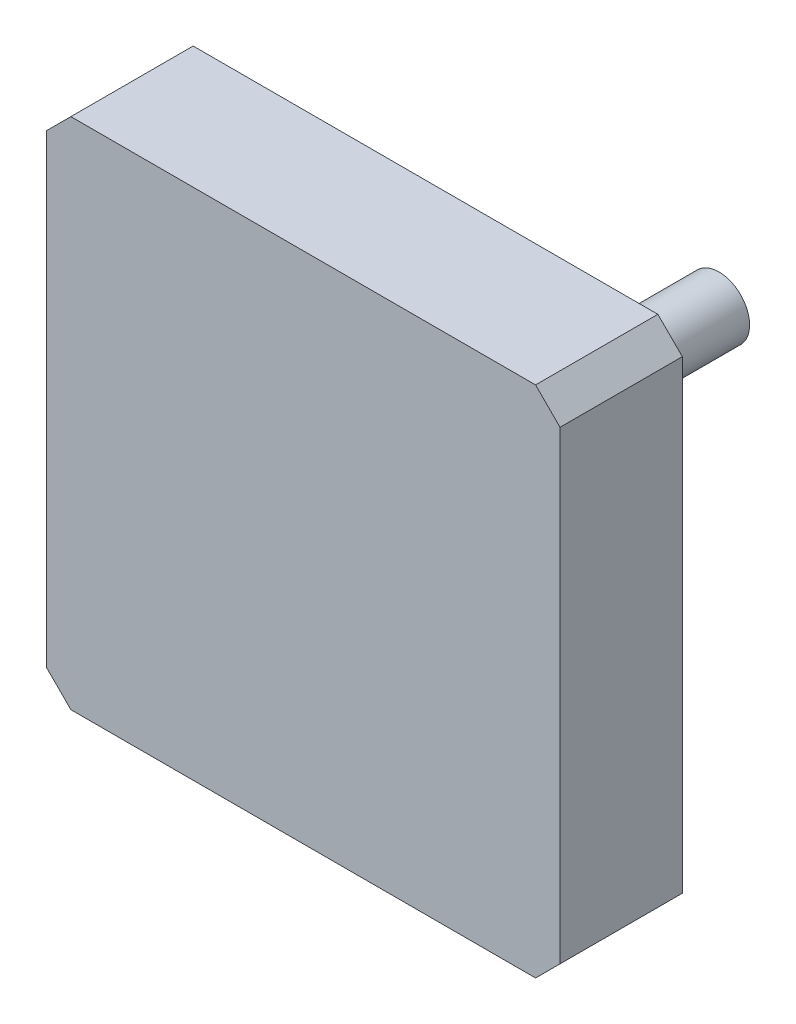
ISO-10303-21;
HEADER;
FILE_DESCRIPTION(('STEP AP214'),'2;1');
FILE_NAME('part.step','',(''),(''),'','','');
FILE_SCHEMA(('AUTOMOTIVE_DESIGN { 1 0 10303 214 1 1 1 1 }'));
ENDSEC;
DATA;
#1=APPLICATION_CONTEXT('core data for automotive mechanical design processes');
#2=APPLICATION_PROTOCOL_DEFINITION('international standard','automotive_design',2000,#1);
#3=PRODUCT_CONTEXT('',#1,'mechanical');
#4=PRODUCT('Part','Part','',(#3));
#5=PRODUCT_RELATED_PRODUCT_CATEGORY('part','',(#4));
#6=PRODUCT_DEFINITION_FORMATION('','',#4);
#7=PRODUCT_DEFINITION_CONTEXT('part definition',#1,'design');
#8=PRODUCT_DEFINITION('design','',#6,#7);
#9=PRODUCT_DEFINITION_SHAPE('','',#8);
#10=(LENGTH_UNIT() NAMED_UNIT(*) SI_UNIT(.MILLI.,.METRE.));
#11=(NAMED_UNIT(*) PLANE_ANGLE_UNIT() SI_UNIT($,.RADIAN.));
#12=(NAMED_UNIT(*) SI_UNIT($,.STERADIAN.) SOLID_ANGLE_UNIT());
#13=UNCERTAINTY_MEASURE_WITH_UNIT(LENGTH_MEASURE(1.E-05),#10,'distance_accuracy_value','');
#14=(GEOMETRIC_REPRESENTATION_CONTEXT(3) GLOBAL_UNCERTAINTY_ASSIGNED_CONTEXT((#13)) GLOBAL_UNIT_ASSIGNED_CONTEXT((#10,
#11,#12)) REPRESENTATION_CONTEXT('',''));
#15=CARTESIAN_POINT('',(0.,0.,0.));
#16=DIRECTION('',(0.,0.,1.));
#17=DIRECTION('',(1.,0.,0.));
#18=AXIS2_PLACEMENT_3D('',#15,#16,#17);
#19=CARTESIAN_POINT('',(0.,0.,-10.));
#20=DIRECTION('',(0.,0.,1.));
#21=DIRECTION('',(-1.,0.,0.));
#22=AXIS2_PLACEMENT_3D('',#19,#20,#21);
#23=PLANE('',#22);
#24=CARTESIAN_POINT('',(-15.4999999999998,15.5000000000002,-10.));
#25=DIRECTION('',(0.,0.,1.));
#26=DIRECTION('',(1.,0.,0.));
#27=AXIS2_PLACEMENT_3D('',#24,#25,#26);
#28=CIRCLE('',#27,1.25);
#29=CARTESIAN_POINT('',(-14.2499999999998,15.5000000000002,-10.));
#30=VERTEX_POINT('',#29);
#31=EDGE_CURVE('E122',#30,#30,#28,.T.);
#32=ORIENTED_EDGE('',*,*,#31,.T.);
#33=EDGE_LOOP('',(#32));
#34=FACE_BOUND('',#33,.T.);
#35=CARTESIAN_POINT('',(-15.5,-15.5,-10.));
#36=DIRECTION('',(0.,0.,1.));
#37=DIRECTION('',(1.,0.,0.));
#38=AXIS2_PLACEMENT_3D('',#35,#36,#37);
#39=CIRCLE('',#38,1.25);
#40=CARTESIAN_POINT('',(-14.25,-15.5,-10.));
#41=VERTEX_POINT('',#40);
#42=EDGE_CURVE('E121',#41,#41,#39,.T.);
#43=ORIENTED_EDGE('',*,*,#42,.T.);
#44=EDGE_LOOP('',(#43));
#45=FACE_BOUND('',#44,.T.);
#46=CARTESIAN_POINT('',(15.4999999999999,-15.5000000000001,-10.));
#47=DIRECTION('',(0.,0.,1.));
#48=DIRECTION('',(1.,0.,0.));
#49=AXIS2_PLACEMENT_3D('',#46,#47,#48);
#50=CIRCLE('',#49,1.25);
#51=CARTESIAN_POINT('',(16.7499999999999,-15.5000000000001,-10.));
#52=VERTEX_POINT('',#51);
#53=EDGE_CURVE('E132',#52,#52,#50,.T.);
#54=ORIENTED_EDGE('',*,*,#53,.T.);
#55=EDGE_LOOP('',(#54));
#56=FACE_BOUND('',#55,.T.);
#57=CARTESIAN_POINT('',(15.5,15.5,-10.));
#58=DIRECTION('',(0.,0.,1.));
#59=DIRECTION('',(1.,0.,0.));
#60=AXIS2_PLACEMENT_3D('',#57,#58,#59);
#61=CIRCLE('',#60,1.25);
#62=CARTESIAN_POINT('',(16.75,15.5,-10.));
#63=VERTEX_POINT('',#62);
#64=EDGE_CURVE('E138',#63,#63,#61,.T.);
#65=ORIENTED_EDGE('',*,*,#64,.T.);
#66=EDGE_LOOP('',(#65));
#67=FACE_BOUND('',#66,.T.);
#68=DIRECTION('',(0.,-1.,0.));
#69=VECTOR('',#68,1.);
#70=CARTESIAN_POINT('',(-21.,-21.,-10.));
#71=LINE('',#70,#69);
#72=CARTESIAN_POINT('',(-21.,19.,-10.));
#73=VERTEX_POINT('',#72);
#74=CARTESIAN_POINT('',(-21.,-19.,-10.));
#75=VERTEX_POINT('',#74);
#76=EDGE_CURVE('E158',#73,#75,#71,.T.);
#77=ORIENTED_EDGE('',*,*,#76,.F.);
#78=DIRECTION('',(0.70710678118655,0.707106781186545,0.));
#79=VECTOR('',#78,1.);
#80=CARTESIAN_POINT('',(-21.,19.,-10.));
#81=LINE('',#80,#79);
#82=CARTESIAN_POINT('',(-19.,21.,-10.));
#83=VERTEX_POINT('',#82);
#84=EDGE_CURVE('E199',#83,#73,#81,.F.);
#85=ORIENTED_EDGE('',*,*,#84,.F.);
#86=DIRECTION('',(-1.,0.,0.));
#87=VECTOR('',#86,1.);
#88=CARTESIAN_POINT('',(-21.,21.,-10.));
#89=LINE('',#88,#87);
#90=CARTESIAN_POINT('',(19.,21.,-10.));
#91=VERTEX_POINT('',#90);
#92=EDGE_CURVE('E155',#91,#83,#89,.T.);
#93=ORIENTED_EDGE('',*,*,#92,.F.);
#94=DIRECTION('',(0.707106781186545,-0.70710678118655,0.));
#95=VECTOR('',#94,1.);
#96=CARTESIAN_POINT('',(19.,21.,-10.));
#97=LINE('',#96,#95);
#98=CARTESIAN_POINT('',(21.,19.,-10.));
#99=VERTEX_POINT('',#98);
#100=EDGE_CURVE('E197',#99,#91,#97,.F.);
#101=ORIENTED_EDGE('',*,*,#100,.F.);
#102=DIRECTION('',(0.,1.,0.));
#103=VECTOR('',#102,1.);
#104=CARTESIAN_POINT('',(21.,-21.,-10.));
#105=LINE('',#104,#103);
#106=CARTESIAN_POINT('',(21.,-19.,-10.));
#107=VERTEX_POINT('',#106);
#108=EDGE_CURVE('E152',#107,#99,#105,.T.);
#109=ORIENTED_EDGE('',*,*,#108,.F.);
#110=DIRECTION('',(-0.70710678118655,-0.707106781186545,0.));
#111=VECTOR('',#110,1.);
#112=CARTESIAN_POINT('',(21.,-19.,-10.));
#113=LINE('',#112,#111);
#114=CARTESIAN_POINT('',(19.,-21.,-10.));
#115=VERTEX_POINT('',#114);
#116=EDGE_CURVE('E201',#115,#107,#113,.F.);
#117=ORIENTED_EDGE('',*,*,#116,.F.);
#118=DIRECTION('',(1.,0.,0.));
#119=VECTOR('',#118,1.);
#120=CARTESIAN_POINT('',(-21.,-21.,-10.));
#121=LINE('',#120,#119);
#122=CARTESIAN_POINT('',(-19.,-21.,-10.));
#123=VERTEX_POINT('',#122);
#124=EDGE_CURVE('E161',#123,#115,#121,.T.);
#125=ORIENTED_EDGE('',*,*,#124,.F.);
#126=DIRECTION('',(-0.707106781186545,0.70710678118655,0.));
#127=VECTOR('',#126,1.);
#128=CARTESIAN_POINT('',(-19.,-21.,-10.));
#129=LINE('',#128,#127);
#130=EDGE_CURVE('E204',#75,#123,#129,.F.);
#131=ORIENTED_EDGE('',*,*,#130,.F.);
#132=EDGE_LOOP('',(#77,#85,#93,#101,#109,#117,#125,#131));
#133=FACE_BOUND('',#132,.T.);
#134=CARTESIAN_POINT('',(0.,0.,-10.));
#135=DIRECTION('',(0.,0.,-1.));
#136=DIRECTION('',(-1.,0.,0.));
#137=AXIS2_PLACEMENT_3D('',#134,#135,#136);
#138=CIRCLE('',#137,11.);
#139=CARTESIAN_POINT('',(-11.,0.,-10.));
#140=VERTEX_POINT('',#139);
#141=EDGE_CURVE('E164',#140,#140,#138,.F.);
#142=ORIENTED_EDGE('',*,*,#141,.T.);
#143=EDGE_LOOP('',(#142));
#144=FACE_BOUND('',#143,.T.);
#145=ADVANCED_FACE('F37',(#34,#45,#56,#67,#133,#144),#23,.F.);
#146=CARTESIAN_POINT('',(21.,-21.,-10.));
#147=DIRECTION('',(-1.,0.,0.));
#148=DIRECTION('',(0.,0.,-1.));
#149=AXIS2_PLACEMENT_3D('',#146,#147,#148);
#150=PLANE('',#149);
#151=ORIENTED_EDGE('',*,*,#108,.T.);
#152=DIRECTION('',(0.,0.,-1.));
#153=VECTOR('',#152,1.);
#154=CARTESIAN_POINT('',(21.,19.,-10.));
#155=LINE('',#154,#153);
#156=CARTESIAN_POINT('',(21.,19.,0.));
#157=VERTEX_POINT('',#156);
#158=EDGE_CURVE('E207',#157,#99,#155,.T.);
#159=ORIENTED_EDGE('',*,*,#158,.F.);
#160=DIRECTION('',(0.,1.,0.));
#161=VECTOR('',#160,1.);
#162=CARTESIAN_POINT('',(21.,-21.,0.));
#163=LINE('',#162,#161);
#164=CARTESIAN_POINT('',(21.,-19.,0.));
#165=VERTEX_POINT('',#164);
#166=EDGE_CURVE('E151',#165,#157,#163,.T.);
#167=ORIENTED_EDGE('',*,*,#166,.F.);
#168=DIRECTION('',(0.,0.,1.));
#169=VECTOR('',#168,1.);
#170=CARTESIAN_POINT('',(21.,-19.,-10.));
#171=LINE('',#170,#169);
#172=EDGE_CURVE('E209',#107,#165,#171,.T.);
#173=ORIENTED_EDGE('',*,*,#172,.F.);
#174=EDGE_LOOP('',(#151,#159,#167,#173));
#175=FACE_BOUND('',#174,.T.);
#176=ADVANCED_FACE('F220',(#175),#150,.F.);
#177=CARTESIAN_POINT('',(-21.,21.,-10.));
#178=DIRECTION('',(0.,-1.,0.));
#179=DIRECTION('',(0.,0.,1.));
#180=AXIS2_PLACEMENT_3D('',#177,#178,#179);
#181=PLANE('',#180);
#182=DIRECTION('',(-1.,0.,0.));
#183=VECTOR('',#182,1.);
#184=CARTESIAN_POINT('',(-21.,21.,0.));
#185=LINE('',#184,#183);
#186=CARTESIAN_POINT('',(19.,21.,0.));
#187=VERTEX_POINT('',#186);
#188=CARTESIAN_POINT('',(-19.,21.,0.));
#189=VERTEX_POINT('',#188);
#190=EDGE_CURVE('E167',#187,#189,#185,.T.);
#191=ORIENTED_EDGE('',*,*,#190,.F.);
#192=DIRECTION('',(0.,0.,1.));
#193=VECTOR('',#192,1.);
#194=CARTESIAN_POINT('',(19.,21.,-10.));
#195=LINE('',#194,#193);
#196=EDGE_CURVE('E45',#91,#187,#195,.T.);
#197=ORIENTED_EDGE('',*,*,#196,.F.);
#198=ORIENTED_EDGE('',*,*,#92,.T.);
#199=DIRECTION('',(0.,0.,-1.));
#200=VECTOR('',#199,1.);
#201=CARTESIAN_POINT('',(-19.,21.,-10.));
#202=LINE('',#201,#200);
#203=EDGE_CURVE('E11',#189,#83,#202,.T.);
#204=ORIENTED_EDGE('',*,*,#203,.F.);
#205=EDGE_LOOP('',(#191,#197,#198,#204));
#206=FACE_BOUND('',#205,.T.);
#207=ADVANCED_FACE('F214',(#206),#181,.F.);
#208=CARTESIAN_POINT('',(-21.,-21.,-10.));
#209=DIRECTION('',(1.,0.,0.));
#210=DIRECTION('',(0.,0.,1.));
#211=AXIS2_PLACEMENT_3D('',#208,#209,#210);
#212=PLANE('',#211);
#213=DIRECTION('',(0.,-1.,0.));
#214=VECTOR('',#213,1.);
#215=CARTESIAN_POINT('',(-21.,-21.,0.));
#216=LINE('',#215,#214);
#217=CARTESIAN_POINT('',(-21.,19.,0.));
#218=VERTEX_POINT('',#217);
#219=CARTESIAN_POINT('',(-21.,-19.,0.));
#220=VERTEX_POINT('',#219);
#221=EDGE_CURVE('E170',#218,#220,#216,.T.);
#222=ORIENTED_EDGE('',*,*,#221,.F.);
#223=DIRECTION('',(0.,0.,1.));
#224=VECTOR('',#223,1.);
#225=CARTESIAN_POINT('',(-21.,19.,-10.));
#226=LINE('',#225,#224);
#227=EDGE_CURVE('E192',#73,#218,#226,.T.);
#228=ORIENTED_EDGE('',*,*,#227,.F.);
#229=ORIENTED_EDGE('',*,*,#76,.T.);
#230=DIRECTION('',(0.,0.,-1.));
#231=VECTOR('',#230,1.);
#232=CARTESIAN_POINT('',(-21.,-19.,-10.));
#233=LINE('',#232,#231);
#234=EDGE_CURVE('E195',#220,#75,#233,.T.);
#235=ORIENTED_EDGE('',*,*,#234,.F.);
#236=EDGE_LOOP('',(#222,#228,#229,#235));
#237=FACE_BOUND('',#236,.T.);
#238=ADVANCED_FACE('F232',(#237),#212,.F.);
#239=CARTESIAN_POINT('',(-21.,-21.,-10.));
#240=DIRECTION('',(0.,1.,0.));
#241=DIRECTION('',(0.,0.,-1.));
#242=AXIS2_PLACEMENT_3D('',#239,#240,#241);
#243=PLANE('',#242);
#244=ORIENTED_EDGE('',*,*,#124,.T.);
#245=DIRECTION('',(0.,0.,-1.));
#246=VECTOR('',#245,1.);
#247=CARTESIAN_POINT('',(19.,-21.,-10.));
#248=LINE('',#247,#246);
#249=CARTESIAN_POINT('',(19.,-21.,0.));
#250=VERTEX_POINT('',#249);
#251=EDGE_CURVE('E179',#250,#115,#248,.T.);
#252=ORIENTED_EDGE('',*,*,#251,.F.);
#253=DIRECTION('',(1.,0.,0.));
#254=VECTOR('',#253,1.);
#255=CARTESIAN_POINT('',(-21.,-21.,0.));
#256=LINE('',#255,#254);
#257=CARTESIAN_POINT('',(-19.,-21.,0.));
#258=VERTEX_POINT('',#257);
#259=EDGE_CURVE('E156',#258,#250,#256,.T.);
#260=ORIENTED_EDGE('',*,*,#259,.F.);
#261=DIRECTION('',(0.,0.,1.));
#262=VECTOR('',#261,1.);
#263=CARTESIAN_POINT('',(-19.,-21.,-10.));
#264=LINE('',#263,#262);
#265=EDGE_CURVE('E181',#123,#258,#264,.T.);
#266=ORIENTED_EDGE('',*,*,#265,.F.);
#267=EDGE_LOOP('',(#244,#252,#260,#266));
#268=FACE_BOUND('',#267,.T.);
#269=ADVANCED_FACE('F239',(#268),#243,.F.);
#270=CARTESIAN_POINT('',(0.,0.,0.));
#271=DIRECTION('',(0.,0.,1.));
#272=DIRECTION('',(-1.,0.,0.));
#273=AXIS2_PLACEMENT_3D('',#270,#271,#272);
#274=PLANE('',#273);
#275=ORIENTED_EDGE('',*,*,#259,.T.);
#276=DIRECTION('',(0.70710678118655,0.707106781186545,0.));
#277=VECTOR('',#276,1.);
#278=CARTESIAN_POINT('',(19.9999999999999,-20.0000000000001,0.));
#279=LINE('',#278,#277);
#280=EDGE_CURVE('E188',#165,#250,#279,.F.);
#281=ORIENTED_EDGE('',*,*,#280,.F.);
#282=ORIENTED_EDGE('',*,*,#166,.T.);
#283=DIRECTION('',(-0.707106781186545,0.70710678118655,0.));
#284=VECTOR('',#283,1.);
#285=CARTESIAN_POINT('',(20.0000000000001,19.9999999999999,0.));
#286=LINE('',#285,#284);
#287=EDGE_CURVE('E184',#187,#157,#286,.F.);
#288=ORIENTED_EDGE('',*,*,#287,.F.);
#289=ORIENTED_EDGE('',*,*,#190,.T.);
#290=DIRECTION('',(-0.70710678118655,-0.707106781186545,0.));
#291=VECTOR('',#290,1.);
#292=CARTESIAN_POINT('',(-19.9999999999999,20.0000000000001,0.));
#293=LINE('',#292,#291);
#294=EDGE_CURVE('E186',#218,#189,#293,.F.);
#295=ORIENTED_EDGE('',*,*,#294,.F.);
#296=ORIENTED_EDGE('',*,*,#221,.T.);
#297=DIRECTION('',(0.707106781186545,-0.70710678118655,0.));
#298=VECTOR('',#297,1.);
#299=CARTESIAN_POINT('',(-20.0000000000001,-19.9999999999999,0.));
#300=LINE('',#299,#298);
#301=EDGE_CURVE('E190',#258,#220,#300,.F.);
#302=ORIENTED_EDGE('',*,*,#301,.F.);
#303=EDGE_LOOP('',(#275,#281,#282,#288,#289,#295,#296,#302));
#304=FACE_BOUND('',#303,.T.);
#305=ADVANCED_FACE('F216',(#304),#274,.T.);
#306=CARTESIAN_POINT('',(0.,0.,-12.));
#307=DIRECTION('',(0.,0.,-1.));
#308=DIRECTION('',(1.,0.,0.));
#309=AXIS2_PLACEMENT_3D('',#306,#307,#308);
#310=PLANE('',#309);
#311=CARTESIAN_POINT('',(0.,0.,-12.));
#312=DIRECTION('',(0.,0.,1.));
#313=DIRECTION('',(1.,0.,0.));
#314=AXIS2_PLACEMENT_3D('',#311,#312,#313);
#315=CIRCLE('',#314,11.);
#316=CARTESIAN_POINT('',(11.,0.,-12.));
#317=VERTEX_POINT('',#316);
#318=EDGE_CURVE('E144',#317,#317,#315,.T.);
#319=ORIENTED_EDGE('',*,*,#318,.F.);
#320=EDGE_LOOP('',(#319));
#321=FACE_BOUND('',#320,.T.);
#322=CARTESIAN_POINT('',(0.,0.,-12.));
#323=DIRECTION('',(0.,0.,1.));
#324=DIRECTION('',(1.,0.,0.));
#325=AXIS2_PLACEMENT_3D('',#322,#323,#324);
#326=CIRCLE('',#325,2.5);
#327=CARTESIAN_POINT('',(2.5,0.,-12.));
#328=VERTEX_POINT('',#327);
#329=EDGE_CURVE('E147',#328,#328,#326,.T.);
#330=ORIENTED_EDGE('',*,*,#329,.T.);
#331=EDGE_LOOP('',(#330));
#332=FACE_BOUND('',#331,.T.);
#333=ADVANCED_FACE('F263',(#321,#332),#310,.T.);
#334=CARTESIAN_POINT('',(0.,0.,-12.));
#335=DIRECTION('',(0.,0.,1.));
#336=DIRECTION('',(-1.,0.,0.));
#337=AXIS2_PLACEMENT_3D('',#334,#335,#336);
#338=CYLINDRICAL_SURFACE('',#337,11.);
#339=ORIENTED_EDGE('',*,*,#318,.T.);
#340=EDGE_LOOP('',(#339));
#341=FACE_BOUND('',#340,.T.);
#342=ORIENTED_EDGE('',*,*,#141,.F.);
#343=EDGE_LOOP('',(#342));
#344=FACE_BOUND('',#343,.T.);
#345=ADVANCED_FACE('F291',(#341,#344),#338,.T.);
#346=CARTESIAN_POINT('',(0.,0.,-34.));
#347=DIRECTION('',(0.,0.,-1.));
#348=DIRECTION('',(1.,0.,0.));
#349=AXIS2_PLACEMENT_3D('',#346,#347,#348);
#350=PLANE('',#349);
#351=CARTESIAN_POINT('',(0.,0.,-34.));
#352=DIRECTION('',(0.,0.,1.));
#353=DIRECTION('',(1.,0.,0.));
#354=AXIS2_PLACEMENT_3D('',#351,#352,#353);
#355=CIRCLE('',#354,2.5);
#356=CARTESIAN_POINT('',(2.5,0.,-34.));
#357=VERTEX_POINT('',#356);
#358=EDGE_CURVE('E148',#357,#357,#355,.T.);
#359=ORIENTED_EDGE('',*,*,#358,.F.);
#360=EDGE_LOOP('',(#359));
#361=FACE_BOUND('',#360,.T.);
#362=ADVANCED_FACE('F299',(#361),#350,.T.);
#363=CARTESIAN_POINT('',(0.,0.,-34.));
#364=DIRECTION('',(0.,0.,1.));
#365=DIRECTION('',(-1.,0.,0.));
#366=AXIS2_PLACEMENT_3D('',#363,#364,#365);
#367=CYLINDRICAL_SURFACE('',#366,2.5);
#368=ORIENTED_EDGE('',*,*,#329,.F.);
#369=EDGE_LOOP('',(#368));
#370=FACE_BOUND('',#369,.T.);
#371=ORIENTED_EDGE('',*,*,#358,.T.);
#372=EDGE_LOOP('',(#371));
#373=FACE_BOUND('',#372,.T.);
#374=ADVANCED_FACE('F248',(#370,#373),#367,.T.);
#375=CARTESIAN_POINT('',(-19.,-21.,-10.));
#376=DIRECTION('',(0.70710678118655,0.707106781186545,0.));
#377=DIRECTION('',(0.,0.,1.));
#378=AXIS2_PLACEMENT_3D('',#375,#376,#377);
#379=PLANE('',#378);
#380=ORIENTED_EDGE('',*,*,#130,.T.);
#381=ORIENTED_EDGE('',*,*,#265,.T.);
#382=ORIENTED_EDGE('',*,*,#301,.T.);
#383=ORIENTED_EDGE('',*,*,#234,.T.);
#384=EDGE_LOOP('',(#380,#381,#382,#383));
#385=FACE_BOUND('',#384,.T.);
#386=ADVANCED_FACE('F236',(#385),#379,.F.);
#387=CARTESIAN_POINT('',(21.,-19.,-10.));
#388=DIRECTION('',(-0.707106781186545,0.70710678118655,0.));
#389=DIRECTION('',(0.,0.,1.));
#390=AXIS2_PLACEMENT_3D('',#387,#388,#389);
#391=PLANE('',#390);
#392=ORIENTED_EDGE('',*,*,#116,.T.);
#393=ORIENTED_EDGE('',*,*,#172,.T.);
#394=ORIENTED_EDGE('',*,*,#280,.T.);
#395=ORIENTED_EDGE('',*,*,#251,.T.);
#396=EDGE_LOOP('',(#392,#393,#394,#395));
#397=FACE_BOUND('',#396,.T.);
#398=ADVANCED_FACE('F241',(#397),#391,.F.);
#399=CARTESIAN_POINT('',(-21.,19.,-10.));
#400=DIRECTION('',(0.707106781186545,-0.70710678118655,0.));
#401=DIRECTION('',(0.,0.,1.));
#402=AXIS2_PLACEMENT_3D('',#399,#400,#401);
#403=PLANE('',#402);
#404=ORIENTED_EDGE('',*,*,#84,.T.);
#405=ORIENTED_EDGE('',*,*,#227,.T.);
#406=ORIENTED_EDGE('',*,*,#294,.T.);
#407=ORIENTED_EDGE('',*,*,#203,.T.);
#408=EDGE_LOOP('',(#404,#405,#406,#407));
#409=FACE_BOUND('',#408,.T.);
#410=ADVANCED_FACE('F228',(#409),#403,.F.);
#411=CARTESIAN_POINT('',(19.,21.,-10.));
#412=DIRECTION('',(-0.70710678118655,-0.707106781186545,0.));
#413=DIRECTION('',(0.,0.,1.));
#414=AXIS2_PLACEMENT_3D('',#411,#412,#413);
#415=PLANE('',#414);
#416=ORIENTED_EDGE('',*,*,#100,.T.);
#417=ORIENTED_EDGE('',*,*,#196,.T.);
#418=ORIENTED_EDGE('',*,*,#287,.T.);
#419=ORIENTED_EDGE('',*,*,#158,.T.);
#420=EDGE_LOOP('',(#416,#417,#418,#419));
#421=FACE_BOUND('',#420,.T.);
#422=ADVANCED_FACE('F39',(#421),#415,.F.);
#423=CARTESIAN_POINT('',(15.5,15.5,-2.5));
#424=DIRECTION('',(0.,0.,-1.));
#425=DIRECTION('',(1.,0.,0.));
#426=AXIS2_PLACEMENT_3D('',#423,#424,#425);
#427=CONICAL_SURFACE('',#426,1.25,1.02974425867665);
#428=CARTESIAN_POINT('',(15.5,15.5,-1.74892422621555));
#429=VERTEX_POINT('',#428);
#430=VERTEX_LOOP('',#429);
#431=FACE_BOUND('',#430,.T.);
#432=CARTESIAN_POINT('',(15.5,15.5,-2.5));
#433=DIRECTION('',(0.,0.,1.));
#434=DIRECTION('',(1.,0.,0.));
#435=AXIS2_PLACEMENT_3D('',#432,#433,#434);
#436=CIRCLE('',#435,1.25);
#437=CARTESIAN_POINT('',(16.75,15.5,-2.5));
#438=VERTEX_POINT('',#437);
#439=EDGE_CURVE('E141',#438,#438,#436,.T.);
#440=ORIENTED_EDGE('',*,*,#439,.F.);
#441=EDGE_LOOP('',(#440));
#442=FACE_BOUND('',#441,.T.);
#443=ADVANCED_FACE('F336',(#431,#442),#427,.F.);
#444=CARTESIAN_POINT('',(15.5,15.5,-10.));
#445=DIRECTION('',(0.,0.,-1.));
#446=DIRECTION('',(1.,0.,0.));
#447=AXIS2_PLACEMENT_3D('',#444,#445,#446);
#448=CYLINDRICAL_SURFACE('',#447,1.25);
#449=ORIENTED_EDGE('',*,*,#439,.T.);
#450=EDGE_LOOP('',(#449));
#451=FACE_BOUND('',#450,.T.);
#452=ORIENTED_EDGE('',*,*,#64,.F.);
#453=EDGE_LOOP('',(#452));
#454=FACE_BOUND('',#453,.T.);
#455=ADVANCED_FACE('F344',(#451,#454),#448,.F.);
#456=CARTESIAN_POINT('',(15.4999999999999,-15.5000000000001,-2.5));
#457=DIRECTION('',(0.,0.,-1.));
#458=DIRECTION('',(1.,0.,0.));
#459=AXIS2_PLACEMENT_3D('',#456,#457,#458);
#460=CONICAL_SURFACE('',#459,1.25,1.02974425867665);
#461=CARTESIAN_POINT('',(15.4999999999999,-15.5000000000001,-1.74892422621555));
#462=VERTEX_POINT('',#461);
#463=VERTEX_LOOP('',#462);
#464=FACE_BOUND('',#463,.T.);
#465=CARTESIAN_POINT('',(15.4999999999999,-15.5000000000001,-2.5));
#466=DIRECTION('',(0.,0.,1.));
#467=DIRECTION('',(1.,0.,0.));
#468=AXIS2_PLACEMENT_3D('',#465,#466,#467);
#469=CIRCLE('',#468,1.25);
#470=CARTESIAN_POINT('',(16.7499999999999,-15.5000000000001,-2.5));
#471=VERTEX_POINT('',#470);
#472=EDGE_CURVE('E135',#471,#471,#469,.T.);
#473=ORIENTED_EDGE('',*,*,#472,.F.);
#474=EDGE_LOOP('',(#473));
#475=FACE_BOUND('',#474,.T.);
#476=ADVANCED_FACE('F355',(#464,#475),#460,.F.);
#477=CARTESIAN_POINT('',(15.4999999999999,-15.5000000000001,-10.));
#478=DIRECTION('',(0.,0.,-1.));
#479=DIRECTION('',(1.,0.,0.));
#480=AXIS2_PLACEMENT_3D('',#477,#478,#479);
#481=CYLINDRICAL_SURFACE('',#480,1.25);
#482=ORIENTED_EDGE('',*,*,#472,.T.);
#483=EDGE_LOOP('',(#482));
#484=FACE_BOUND('',#483,.T.);
#485=ORIENTED_EDGE('',*,*,#53,.F.);
#486=EDGE_LOOP('',(#485));
#487=FACE_BOUND('',#486,.T.);
#488=ADVANCED_FACE('F367',(#484,#487),#481,.F.);
#489=CARTESIAN_POINT('',(-15.5,-15.5,-2.5));
#490=DIRECTION('',(0.,0.,-1.));
#491=DIRECTION('',(1.,0.,0.));
#492=AXIS2_PLACEMENT_3D('',#489,#490,#491);
#493=CONICAL_SURFACE('',#492,1.25,1.02974425867665);
#494=CARTESIAN_POINT('',(-15.5,-15.5,-1.74892422621555));
#495=VERTEX_POINT('',#494);
#496=VERTEX_LOOP('',#495);
#497=FACE_BOUND('',#496,.T.);
#498=CARTESIAN_POINT('',(-15.5,-15.5,-2.5));
#499=DIRECTION('',(0.,0.,1.));
#500=DIRECTION('',(1.,0.,0.));
#501=AXIS2_PLACEMENT_3D('',#498,#499,#500);
#502=CIRCLE('',#501,1.25);
#503=CARTESIAN_POINT('',(-14.25,-15.5,-2.5));
#504=VERTEX_POINT('',#503);
#505=EDGE_CURVE('E125',#504,#504,#502,.T.);
#506=ORIENTED_EDGE('',*,*,#505,.F.);
#507=EDGE_LOOP('',(#506));
#508=FACE_BOUND('',#507,.T.);
#509=ADVANCED_FACE('F377',(#497,#508),#493,.F.);
#510=CARTESIAN_POINT('',(-15.5,-15.5,-10.));
#511=DIRECTION('',(0.,0.,-1.));
#512=DIRECTION('',(1.,0.,0.));
#513=AXIS2_PLACEMENT_3D('',#510,#511,#512);
#514=CYLINDRICAL_SURFACE('',#513,1.25);
#515=ORIENTED_EDGE('',*,*,#505,.T.);
#516=EDGE_LOOP('',(#515));
#517=FACE_BOUND('',#516,.T.);
#518=ORIENTED_EDGE('',*,*,#42,.F.);
#519=EDGE_LOOP('',(#518));
#520=FACE_BOUND('',#519,.T.);
#521=ADVANCED_FACE('F115',(#517,#520),#514,.F.);
#522=CARTESIAN_POINT('',(-15.4999999999998,15.5000000000002,-2.5));
#523=DIRECTION('',(0.,0.,-1.));
#524=DIRECTION('',(1.,0.,0.));
#525=AXIS2_PLACEMENT_3D('',#522,#523,#524);
#526=CONICAL_SURFACE('',#525,1.25,1.02974425867665);
#527=CARTESIAN_POINT('',(-15.4999999999998,15.5000000000002,-1.74892422621555));
#528=VERTEX_POINT('',#527);
#529=VERTEX_LOOP('',#528);
#530=FACE_BOUND('',#529,.T.);
#531=CARTESIAN_POINT('',(-15.4999999999998,15.5000000000002,-2.5));
#532=DIRECTION('',(0.,0.,1.));
#533=DIRECTION('',(1.,0.,0.));
#534=AXIS2_PLACEMENT_3D('',#531,#532,#533);
#535=CIRCLE('',#534,1.25);
#536=CARTESIAN_POINT('',(-14.2499999999998,15.5000000000002,-2.5));
#537=VERTEX_POINT('',#536);
#538=EDGE_CURVE('E119',#537,#537,#535,.T.);
#539=ORIENTED_EDGE('',*,*,#538,.F.);
#540=EDGE_LOOP('',(#539));
#541=FACE_BOUND('',#540,.T.);
#542=ADVANCED_FACE('F111',(#530,#541),#526,.F.);
#543=CARTESIAN_POINT('',(-15.4999999999998,15.5000000000002,-10.));
#544=DIRECTION('',(0.,0.,-1.));
#545=DIRECTION('',(1.,0.,0.));
#546=AXIS2_PLACEMENT_3D('',#543,#544,#545);
#547=CYLINDRICAL_SURFACE('',#546,1.25);
#548=ORIENTED_EDGE('',*,*,#538,.T.);
#549=EDGE_LOOP('',(#548));
#550=FACE_BOUND('',#549,.T.);
#551=ORIENTED_EDGE('',*,*,#31,.F.);
#552=EDGE_LOOP('',(#551));
#553=FACE_BOUND('',#552,.T.);
#554=ADVANCED_FACE('F114',(#550,#553),#547,.F.);
#555=CLOSED_SHELL('',(#145,#176,#207,#238,#269,#305,#333,#345,#362,#374,#386,#398,#410,#422,
#443,#455,#476,#488,#509,#521,#542,#554));
#556=MANIFOLD_SOLID_BREP('B2',#555);
#557=ADVANCED_BREP_SHAPE_REPRESENTATION('',(#18,#556),#14);
#558=SHAPE_DEFINITION_REPRESENTATION(#9,#557);
ENDSEC;
END-ISO-10303-21;
